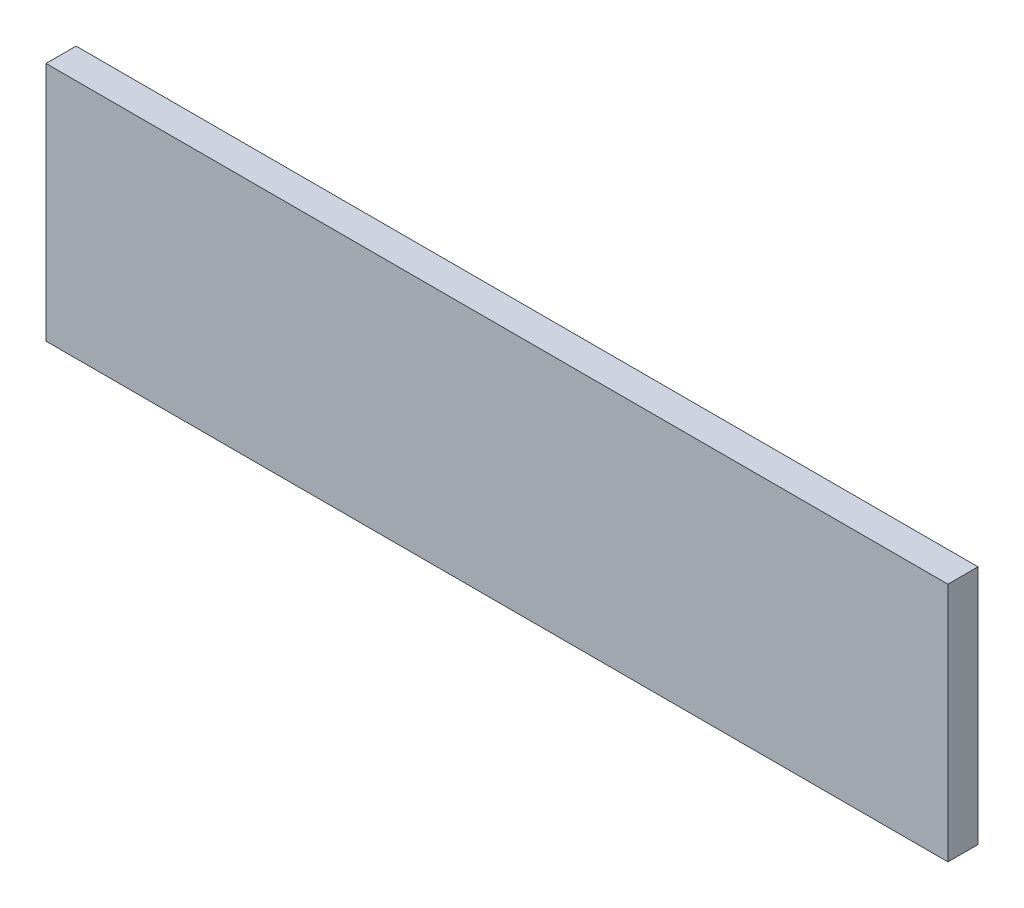
ISO-10303-21;
HEADER;
FILE_DESCRIPTION(('STEP AP214'),'2;1');
FILE_NAME('part.step','',(''),(''),'','','');
FILE_SCHEMA(('AUTOMOTIVE_DESIGN { 1 0 10303 214 1 1 1 1 }'));
ENDSEC;
DATA;
#1=APPLICATION_CONTEXT('core data for automotive mechanical design processes');
#2=APPLICATION_PROTOCOL_DEFINITION('international standard','automotive_design',2000,#1);
#3=PRODUCT_CONTEXT('',#1,'mechanical');
#4=PRODUCT('Part','Part','',(#3));
#5=PRODUCT_RELATED_PRODUCT_CATEGORY('part','',(#4));
#6=PRODUCT_DEFINITION_FORMATION('','',#4);
#7=PRODUCT_DEFINITION_CONTEXT('part definition',#1,'design');
#8=PRODUCT_DEFINITION('design','',#6,#7);
#9=PRODUCT_DEFINITION_SHAPE('','',#8);
#10=(LENGTH_UNIT() NAMED_UNIT(*) SI_UNIT(.MILLI.,.METRE.));
#11=(NAMED_UNIT(*) PLANE_ANGLE_UNIT() SI_UNIT($,.RADIAN.));
#12=(NAMED_UNIT(*) SI_UNIT($,.STERADIAN.) SOLID_ANGLE_UNIT());
#13=UNCERTAINTY_MEASURE_WITH_UNIT(LENGTH_MEASURE(1.E-05),#10,'distance_accuracy_value','');
#14=(GEOMETRIC_REPRESENTATION_CONTEXT(3) GLOBAL_UNCERTAINTY_ASSIGNED_CONTEXT((#13)) GLOBAL_UNIT_ASSIGNED_CONTEXT((#10,
#11,#12)) REPRESENTATION_CONTEXT('',''));
#15=CARTESIAN_POINT('',(0.,0.,0.));
#16=DIRECTION('',(0.,0.,1.));
#17=DIRECTION('',(1.,0.,0.));
#18=AXIS2_PLACEMENT_3D('',#15,#16,#17);
#19=CARTESIAN_POINT('',(-150.,40.,10.));
#20=DIRECTION('',(1.,0.,0.));
#21=DIRECTION('',(0.,1.,0.));
#22=AXIS2_PLACEMENT_3D('',#19,#20,#21);
#23=PLANE('',#22);
#24=DIRECTION('',(0.,-1.,0.));
#25=VECTOR('',#24,1.);
#26=CARTESIAN_POINT('',(-150.,40.,0.));
#27=LINE('',#26,#25);
#28=CARTESIAN_POINT('',(-150.,40.,0.));
#29=VERTEX_POINT('',#28);
#30=CARTESIAN_POINT('',(-150.,-40.,0.));
#31=VERTEX_POINT('',#30);
#32=EDGE_CURVE('E97',#29,#31,#27,.T.);
#33=ORIENTED_EDGE('',*,*,#32,.T.);
#34=DIRECTION('',(0.,0.,-1.));
#35=VECTOR('',#34,1.);
#36=CARTESIAN_POINT('',(-150.,-40.,10.));
#37=LINE('',#36,#35);
#38=CARTESIAN_POINT('',(-150.,-40.,10.));
#39=VERTEX_POINT('',#38);
#40=EDGE_CURVE('E11',#39,#31,#37,.T.);
#41=ORIENTED_EDGE('',*,*,#40,.F.);
#42=DIRECTION('',(0.,-1.,0.));
#43=VECTOR('',#42,1.);
#44=CARTESIAN_POINT('',(-150.,40.,10.));
#45=LINE('',#44,#43);
#46=CARTESIAN_POINT('',(-150.,40.,10.));
#47=VERTEX_POINT('',#46);
#48=EDGE_CURVE('E85',#47,#39,#45,.T.);
#49=ORIENTED_EDGE('',*,*,#48,.F.);
#50=DIRECTION('',(0.,0.,-1.));
#51=VECTOR('',#50,1.);
#52=CARTESIAN_POINT('',(-150.,40.,10.));
#53=LINE('',#52,#51);
#54=EDGE_CURVE('E93',#47,#29,#53,.T.);
#55=ORIENTED_EDGE('',*,*,#54,.T.);
#56=EDGE_LOOP('',(#33,#41,#49,#55));
#57=FACE_BOUND('',#56,.T.);
#58=ADVANCED_FACE('F34',(#57),#23,.F.);
#59=CARTESIAN_POINT('',(150.,-40.,10.));
#60=DIRECTION('',(0.,1.,0.));
#61=DIRECTION('',(-1.,0.,0.));
#62=AXIS2_PLACEMENT_3D('',#59,#60,#61);
#63=PLANE('',#62);
#64=DIRECTION('',(1.,0.,0.));
#65=VECTOR('',#64,1.);
#66=CARTESIAN_POINT('',(150.,-40.,0.));
#67=LINE('',#66,#65);
#68=CARTESIAN_POINT('',(150.,-40.,0.));
#69=VERTEX_POINT('',#68);
#70=EDGE_CURVE('E89',#31,#69,#67,.T.);
#71=ORIENTED_EDGE('',*,*,#70,.T.);
#72=DIRECTION('',(0.,0.,-1.));
#73=VECTOR('',#72,1.);
#74=CARTESIAN_POINT('',(150.,-40.,10.));
#75=LINE('',#74,#73);
#76=CARTESIAN_POINT('',(150.,-40.,10.));
#77=VERTEX_POINT('',#76);
#78=EDGE_CURVE('E42',#77,#69,#75,.T.);
#79=ORIENTED_EDGE('',*,*,#78,.F.);
#80=DIRECTION('',(1.,0.,0.));
#81=VECTOR('',#80,1.);
#82=CARTESIAN_POINT('',(150.,-40.,10.));
#83=LINE('',#82,#81);
#84=EDGE_CURVE('E80',#39,#77,#83,.T.);
#85=ORIENTED_EDGE('',*,*,#84,.F.);
#86=ORIENTED_EDGE('',*,*,#40,.T.);
#87=EDGE_LOOP('',(#71,#79,#85,#86));
#88=FACE_BOUND('',#87,.T.);
#89=ADVANCED_FACE('F88',(#88),#63,.F.);
#90=CARTESIAN_POINT('',(150.,40.,10.));
#91=DIRECTION('',(-1.,0.,0.));
#92=DIRECTION('',(0.,-1.,0.));
#93=AXIS2_PLACEMENT_3D('',#90,#91,#92);
#94=PLANE('',#93);
#95=DIRECTION('',(0.,1.,0.));
#96=VECTOR('',#95,1.);
#97=CARTESIAN_POINT('',(150.,40.,0.));
#98=LINE('',#97,#96);
#99=CARTESIAN_POINT('',(150.,40.,0.));
#100=VERTEX_POINT('',#99);
#101=EDGE_CURVE('E67',#69,#100,#98,.T.);
#102=ORIENTED_EDGE('',*,*,#101,.T.);
#103=DIRECTION('',(0.,0.,-1.));
#104=VECTOR('',#103,1.);
#105=CARTESIAN_POINT('',(150.,40.,10.));
#106=LINE('',#105,#104);
#107=CARTESIAN_POINT('',(150.,40.,10.));
#108=VERTEX_POINT('',#107);
#109=EDGE_CURVE('E90',#108,#100,#106,.T.);
#110=ORIENTED_EDGE('',*,*,#109,.F.);
#111=DIRECTION('',(0.,1.,0.));
#112=VECTOR('',#111,1.);
#113=CARTESIAN_POINT('',(150.,40.,10.));
#114=LINE('',#113,#112);
#115=EDGE_CURVE('E83',#77,#108,#114,.T.);
#116=ORIENTED_EDGE('',*,*,#115,.F.);
#117=ORIENTED_EDGE('',*,*,#78,.T.);
#118=EDGE_LOOP('',(#102,#110,#116,#117));
#119=FACE_BOUND('',#118,.T.);
#120=ADVANCED_FACE('F91',(#119),#94,.F.);
#121=CARTESIAN_POINT('',(150.,40.,10.));
#122=DIRECTION('',(0.,-1.,0.));
#123=DIRECTION('',(1.,0.,0.));
#124=AXIS2_PLACEMENT_3D('',#121,#122,#123);
#125=PLANE('',#124);
#126=DIRECTION('',(-1.,0.,0.));
#127=VECTOR('',#126,1.);
#128=CARTESIAN_POINT('',(150.,40.,0.));
#129=LINE('',#128,#127);
#130=EDGE_CURVE('E73',#100,#29,#129,.T.);
#131=ORIENTED_EDGE('',*,*,#130,.T.);
#132=ORIENTED_EDGE('',*,*,#54,.F.);
#133=DIRECTION('',(-1.,0.,0.));
#134=VECTOR('',#133,1.);
#135=CARTESIAN_POINT('',(150.,40.,10.));
#136=LINE('',#135,#134);
#137=EDGE_CURVE('E50',#108,#47,#136,.T.);
#138=ORIENTED_EDGE('',*,*,#137,.F.);
#139=ORIENTED_EDGE('',*,*,#109,.T.);
#140=EDGE_LOOP('',(#131,#132,#138,#139));
#141=FACE_BOUND('',#140,.T.);
#142=ADVANCED_FACE('F104',(#141),#125,.F.);
#143=CARTESIAN_POINT('',(0.,0.,10.));
#144=DIRECTION('',(0.,0.,-1.));
#145=DIRECTION('',(-1.,0.,0.));
#146=AXIS2_PLACEMENT_3D('',#143,#144,#145);
#147=PLANE('',#146);
#148=ORIENTED_EDGE('',*,*,#48,.T.);
#149=ORIENTED_EDGE('',*,*,#84,.T.);
#150=ORIENTED_EDGE('',*,*,#115,.T.);
#151=ORIENTED_EDGE('',*,*,#137,.T.);
#152=EDGE_LOOP('',(#148,#149,#150,#151));
#153=FACE_BOUND('',#152,.T.);
#154=ADVANCED_FACE('F81',(#153),#147,.F.);
#155=CARTESIAN_POINT('',(0.,0.,0.));
#156=DIRECTION('',(0.,0.,-1.));
#157=DIRECTION('',(-1.,0.,0.));
#158=AXIS2_PLACEMENT_3D('',#155,#156,#157);
#159=PLANE('',#158);
#160=ORIENTED_EDGE('',*,*,#32,.F.);
#161=ORIENTED_EDGE('',*,*,#130,.F.);
#162=ORIENTED_EDGE('',*,*,#101,.F.);
#163=ORIENTED_EDGE('',*,*,#70,.F.);
#164=EDGE_LOOP('',(#160,#161,#162,#163));
#165=FACE_BOUND('',#164,.T.);
#166=ADVANCED_FACE('F107',(#165),#159,.T.);
#167=CLOSED_SHELL('',(#58,#89,#120,#142,#154,#166));
#168=MANIFOLD_SOLID_BREP('B2',#167);
#169=ADVANCED_BREP_SHAPE_REPRESENTATION('',(#18,#168),#14);
#170=SHAPE_DEFINITION_REPRESENTATION(#9,#169);
ENDSEC;
END-ISO-10303-21;
